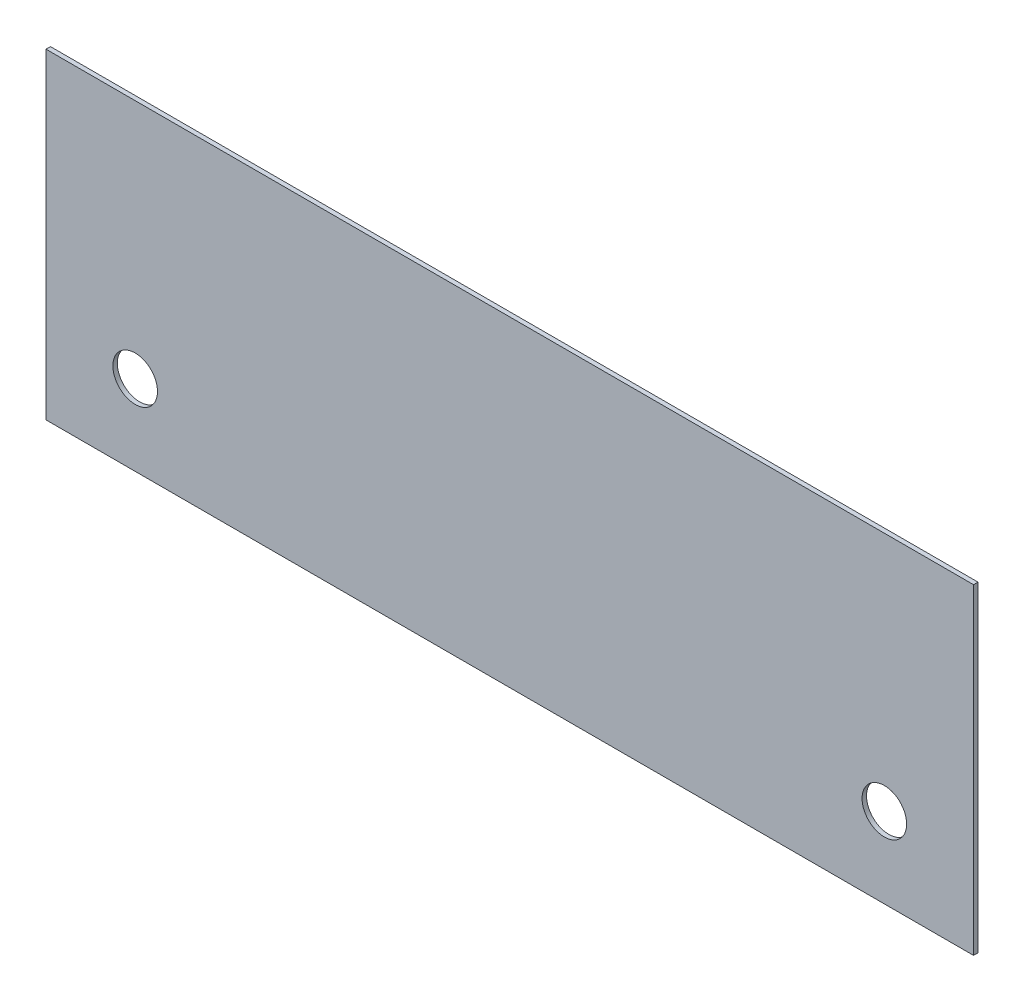
ISO-10303-21;
HEADER;
FILE_DESCRIPTION(('STEP AP214'),'2;1');
FILE_NAME('part.step','',(''),(''),'','','');
FILE_SCHEMA(('AUTOMOTIVE_DESIGN { 1 0 10303 214 1 1 1 1 }'));
ENDSEC;
DATA;
#1=APPLICATION_CONTEXT('core data for automotive mechanical design processes');
#2=APPLICATION_PROTOCOL_DEFINITION('international standard','automotive_design',2000,#1);
#3=PRODUCT_CONTEXT('',#1,'mechanical');
#4=PRODUCT('Part','Part','',(#3));
#5=PRODUCT_RELATED_PRODUCT_CATEGORY('part','',(#4));
#6=PRODUCT_DEFINITION_FORMATION('','',#4);
#7=PRODUCT_DEFINITION_CONTEXT('part definition',#1,'design');
#8=PRODUCT_DEFINITION('design','',#6,#7);
#9=PRODUCT_DEFINITION_SHAPE('','',#8);
#10=(LENGTH_UNIT() NAMED_UNIT(*) SI_UNIT(.MILLI.,.METRE.));
#11=(NAMED_UNIT(*) PLANE_ANGLE_UNIT() SI_UNIT($,.RADIAN.));
#12=(NAMED_UNIT(*) SI_UNIT($,.STERADIAN.) SOLID_ANGLE_UNIT());
#13=UNCERTAINTY_MEASURE_WITH_UNIT(LENGTH_MEASURE(1.E-05),#10,'distance_accuracy_value','');
#14=(GEOMETRIC_REPRESENTATION_CONTEXT(3) GLOBAL_UNCERTAINTY_ASSIGNED_CONTEXT((#13)) GLOBAL_UNIT_ASSIGNED_CONTEXT((#10,
#11,#12)) REPRESENTATION_CONTEXT('',''));
#15=CARTESIAN_POINT('',(0.,0.,0.));
#16=DIRECTION('',(0.,0.,1.));
#17=DIRECTION('',(1.,0.,0.));
#18=AXIS2_PLACEMENT_3D('',#15,#16,#17);
#19=CARTESIAN_POINT('',(52.,-39.,0.5));
#20=DIRECTION('',(-1.,0.,0.));
#21=DIRECTION('',(0.,0.,1.));
#22=AXIS2_PLACEMENT_3D('',#19,#20,#21);
#23=PLANE('',#22);
#24=DIRECTION('',(0.,1.,0.));
#25=VECTOR('',#24,1.);
#26=CARTESIAN_POINT('',(52.,-39.,0.));
#27=LINE('',#26,#25);
#28=CARTESIAN_POINT('',(52.,-39.,0.));
#29=VERTEX_POINT('',#28);
#30=CARTESIAN_POINT('',(52.,-3.,0.));
#31=VERTEX_POINT('',#30);
#32=EDGE_CURVE('E98',#29,#31,#27,.T.);
#33=ORIENTED_EDGE('',*,*,#32,.T.);
#34=DIRECTION('',(0.,0.,-1.));
#35=VECTOR('',#34,1.);
#36=CARTESIAN_POINT('',(52.,-3.,0.5));
#37=LINE('',#36,#35);
#38=CARTESIAN_POINT('',(52.,-3.,0.5));
#39=VERTEX_POINT('',#38);
#40=EDGE_CURVE('E11',#39,#31,#37,.T.);
#41=ORIENTED_EDGE('',*,*,#40,.F.);
#42=DIRECTION('',(0.,1.,0.));
#43=VECTOR('',#42,1.);
#44=CARTESIAN_POINT('',(52.,-39.,0.5));
#45=LINE('',#44,#43);
#46=CARTESIAN_POINT('',(52.,-39.,0.5));
#47=VERTEX_POINT('',#46);
#48=EDGE_CURVE('E86',#47,#39,#45,.T.);
#49=ORIENTED_EDGE('',*,*,#48,.F.);
#50=DIRECTION('',(0.,0.,-1.));
#51=VECTOR('',#50,1.);
#52=CARTESIAN_POINT('',(52.,-39.,0.5));
#53=LINE('',#52,#51);
#54=EDGE_CURVE('E94',#47,#29,#53,.T.);
#55=ORIENTED_EDGE('',*,*,#54,.T.);
#56=EDGE_LOOP('',(#33,#41,#49,#55));
#57=FACE_BOUND('',#56,.T.);
#58=ADVANCED_FACE('F35',(#57),#23,.F.);
#59=CARTESIAN_POINT('',(-52.,-3.,0.5));
#60=DIRECTION('',(0.,-1.,0.));
#61=DIRECTION('',(0.,0.,-1.));
#62=AXIS2_PLACEMENT_3D('',#59,#60,#61);
#63=PLANE('',#62);
#64=DIRECTION('',(-1.,0.,0.));
#65=VECTOR('',#64,1.);
#66=CARTESIAN_POINT('',(-52.,-3.,0.));
#67=LINE('',#66,#65);
#68=CARTESIAN_POINT('',(-52.,-3.,0.));
#69=VERTEX_POINT('',#68);
#70=EDGE_CURVE('E90',#31,#69,#67,.T.);
#71=ORIENTED_EDGE('',*,*,#70,.T.);
#72=DIRECTION('',(0.,0.,-1.));
#73=VECTOR('',#72,1.);
#74=CARTESIAN_POINT('',(-52.,-3.,0.5));
#75=LINE('',#74,#73);
#76=CARTESIAN_POINT('',(-52.,-3.,0.5));
#77=VERTEX_POINT('',#76);
#78=EDGE_CURVE('E43',#77,#69,#75,.T.);
#79=ORIENTED_EDGE('',*,*,#78,.F.);
#80=DIRECTION('',(-1.,0.,0.));
#81=VECTOR('',#80,1.);
#82=CARTESIAN_POINT('',(-52.,-3.,0.5));
#83=LINE('',#82,#81);
#84=EDGE_CURVE('E81',#39,#77,#83,.T.);
#85=ORIENTED_EDGE('',*,*,#84,.F.);
#86=ORIENTED_EDGE('',*,*,#40,.T.);
#87=EDGE_LOOP('',(#71,#79,#85,#86));
#88=FACE_BOUND('',#87,.T.);
#89=ADVANCED_FACE('F89',(#88),#63,.F.);
#90=CARTESIAN_POINT('',(-52.,-39.,0.5));
#91=DIRECTION('',(1.,0.,0.));
#92=DIRECTION('',(0.,0.,-1.));
#93=AXIS2_PLACEMENT_3D('',#90,#91,#92);
#94=PLANE('',#93);
#95=DIRECTION('',(0.,-1.,0.));
#96=VECTOR('',#95,1.);
#97=CARTESIAN_POINT('',(-52.,-39.,0.));
#98=LINE('',#97,#96);
#99=CARTESIAN_POINT('',(-52.,-39.,0.));
#100=VERTEX_POINT('',#99);
#101=EDGE_CURVE('E68',#69,#100,#98,.T.);
#102=ORIENTED_EDGE('',*,*,#101,.T.);
#103=DIRECTION('',(0.,0.,-1.));
#104=VECTOR('',#103,1.);
#105=CARTESIAN_POINT('',(-52.,-39.,0.5));
#106=LINE('',#105,#104);
#107=CARTESIAN_POINT('',(-52.,-39.,0.5));
#108=VERTEX_POINT('',#107);
#109=EDGE_CURVE('E91',#108,#100,#106,.T.);
#110=ORIENTED_EDGE('',*,*,#109,.F.);
#111=DIRECTION('',(0.,-1.,0.));
#112=VECTOR('',#111,1.);
#113=CARTESIAN_POINT('',(-52.,-39.,0.5));
#114=LINE('',#113,#112);
#115=EDGE_CURVE('E84',#77,#108,#114,.T.);
#116=ORIENTED_EDGE('',*,*,#115,.F.);
#117=ORIENTED_EDGE('',*,*,#78,.T.);
#118=EDGE_LOOP('',(#102,#110,#116,#117));
#119=FACE_BOUND('',#118,.T.);
#120=ADVANCED_FACE('F92',(#119),#94,.F.);
#121=CARTESIAN_POINT('',(-52.,-39.,0.5));
#122=DIRECTION('',(0.,1.,0.));
#123=DIRECTION('',(0.,0.,1.));
#124=AXIS2_PLACEMENT_3D('',#121,#122,#123);
#125=PLANE('',#124);
#126=DIRECTION('',(1.,0.,0.));
#127=VECTOR('',#126,1.);
#128=CARTESIAN_POINT('',(-52.,-39.,0.));
#129=LINE('',#128,#127);
#130=EDGE_CURVE('E74',#100,#29,#129,.T.);
#131=ORIENTED_EDGE('',*,*,#130,.T.);
#132=ORIENTED_EDGE('',*,*,#54,.F.);
#133=DIRECTION('',(1.,0.,0.));
#134=VECTOR('',#133,1.);
#135=CARTESIAN_POINT('',(-52.,-39.,0.5));
#136=LINE('',#135,#134);
#137=EDGE_CURVE('E51',#108,#47,#136,.T.);
#138=ORIENTED_EDGE('',*,*,#137,.F.);
#139=ORIENTED_EDGE('',*,*,#109,.T.);
#140=EDGE_LOOP('',(#131,#132,#138,#139));
#141=FACE_BOUND('',#140,.T.);
#142=ADVANCED_FACE('F106',(#141),#125,.F.);
#143=CARTESIAN_POINT('',(0.,0.,0.5));
#144=DIRECTION('',(0.,0.,-1.));
#145=DIRECTION('',(-1.,0.,0.));
#146=AXIS2_PLACEMENT_3D('',#143,#144,#145);
#147=PLANE('',#146);
#148=CARTESIAN_POINT('',(-42.,-30.,0.5));
#149=DIRECTION('',(0.,0.,1.));
#150=DIRECTION('',(1.,0.,0.));
#151=AXIS2_PLACEMENT_3D('',#148,#149,#150);
#152=CIRCLE('',#151,2.5);
#153=CARTESIAN_POINT('',(-39.5,-30.,0.5));
#154=VERTEX_POINT('',#153);
#155=EDGE_CURVE('E101',#154,#154,#152,.T.);
#156=ORIENTED_EDGE('',*,*,#155,.F.);
#157=EDGE_LOOP('',(#156));
#158=FACE_BOUND('',#157,.T.);
#159=CARTESIAN_POINT('',(42.,-30.,0.5));
#160=DIRECTION('',(0.,0.,1.));
#161=DIRECTION('',(1.,0.,0.));
#162=AXIS2_PLACEMENT_3D('',#159,#160,#161);
#163=CIRCLE('',#162,2.5);
#164=CARTESIAN_POINT('',(44.5,-30.,0.5));
#165=VERTEX_POINT('',#164);
#166=EDGE_CURVE('E115',#165,#165,#163,.T.);
#167=ORIENTED_EDGE('',*,*,#166,.F.);
#168=EDGE_LOOP('',(#167));
#169=FACE_BOUND('',#168,.T.);
#170=ORIENTED_EDGE('',*,*,#48,.T.);
#171=ORIENTED_EDGE('',*,*,#84,.T.);
#172=ORIENTED_EDGE('',*,*,#115,.T.);
#173=ORIENTED_EDGE('',*,*,#137,.T.);
#174=EDGE_LOOP('',(#170,#171,#172,#173));
#175=FACE_BOUND('',#174,.T.);
#176=ADVANCED_FACE('F82',(#158,#169,#175),#147,.F.);
#177=CARTESIAN_POINT('',(0.,0.,0.));
#178=DIRECTION('',(0.,0.,-1.));
#179=DIRECTION('',(-1.,0.,0.));
#180=AXIS2_PLACEMENT_3D('',#177,#178,#179);
#181=PLANE('',#180);
#182=CARTESIAN_POINT('',(-42.,-30.,0.));
#183=DIRECTION('',(0.,0.,1.));
#184=DIRECTION('',(1.,0.,0.));
#185=AXIS2_PLACEMENT_3D('',#182,#183,#184);
#186=CIRCLE('',#185,2.5);
#187=CARTESIAN_POINT('',(-39.5,-30.,0.));
#188=VERTEX_POINT('',#187);
#189=EDGE_CURVE('E118',#188,#188,#186,.T.);
#190=ORIENTED_EDGE('',*,*,#189,.T.);
#191=EDGE_LOOP('',(#190));
#192=FACE_BOUND('',#191,.T.);
#193=CARTESIAN_POINT('',(42.,-30.,0.));
#194=DIRECTION('',(0.,0.,1.));
#195=DIRECTION('',(1.,0.,0.));
#196=AXIS2_PLACEMENT_3D('',#193,#194,#195);
#197=CIRCLE('',#196,2.5);
#198=CARTESIAN_POINT('',(44.5,-30.,0.));
#199=VERTEX_POINT('',#198);
#200=EDGE_CURVE('E112',#199,#199,#197,.T.);
#201=ORIENTED_EDGE('',*,*,#200,.T.);
#202=EDGE_LOOP('',(#201));
#203=FACE_BOUND('',#202,.T.);
#204=ORIENTED_EDGE('',*,*,#32,.F.);
#205=ORIENTED_EDGE('',*,*,#130,.F.);
#206=ORIENTED_EDGE('',*,*,#101,.F.);
#207=ORIENTED_EDGE('',*,*,#70,.F.);
#208=EDGE_LOOP('',(#204,#205,#206,#207));
#209=FACE_BOUND('',#208,.T.);
#210=ADVANCED_FACE('F109',(#192,#203,#209),#181,.T.);
#211=CARTESIAN_POINT('',(42.,-30.,0.5));
#212=DIRECTION('',(0.,0.,-1.));
#213=DIRECTION('',(-1.,0.,0.));
#214=AXIS2_PLACEMENT_3D('',#211,#212,#213);
#215=CYLINDRICAL_SURFACE('',#214,2.5);
#216=ORIENTED_EDGE('',*,*,#166,.T.);
#217=EDGE_LOOP('',(#216));
#218=FACE_BOUND('',#217,.T.);
#219=ORIENTED_EDGE('',*,*,#200,.F.);
#220=EDGE_LOOP('',(#219));
#221=FACE_BOUND('',#220,.T.);
#222=ADVANCED_FACE('F132',(#218,#221),#215,.F.);
#223=CARTESIAN_POINT('',(-42.,-30.,0.5));
#224=DIRECTION('',(0.,0.,-1.));
#225=DIRECTION('',(-1.,0.,0.));
#226=AXIS2_PLACEMENT_3D('',#223,#224,#225);
#227=CYLINDRICAL_SURFACE('',#226,2.5);
#228=ORIENTED_EDGE('',*,*,#155,.T.);
#229=EDGE_LOOP('',(#228));
#230=FACE_BOUND('',#229,.T.);
#231=ORIENTED_EDGE('',*,*,#189,.F.);
#232=EDGE_LOOP('',(#231));
#233=FACE_BOUND('',#232,.T.);
#234=ADVANCED_FACE('F124',(#230,#233),#227,.F.);
#235=CLOSED_SHELL('',(#58,#89,#120,#142,#176,#210,#222,#234));
#236=MANIFOLD_SOLID_BREP('B2',#235);
#237=ADVANCED_BREP_SHAPE_REPRESENTATION('',(#18,#236),#14);
#238=SHAPE_DEFINITION_REPRESENTATION(#9,#237);
ENDSEC;
END-ISO-10303-21;
